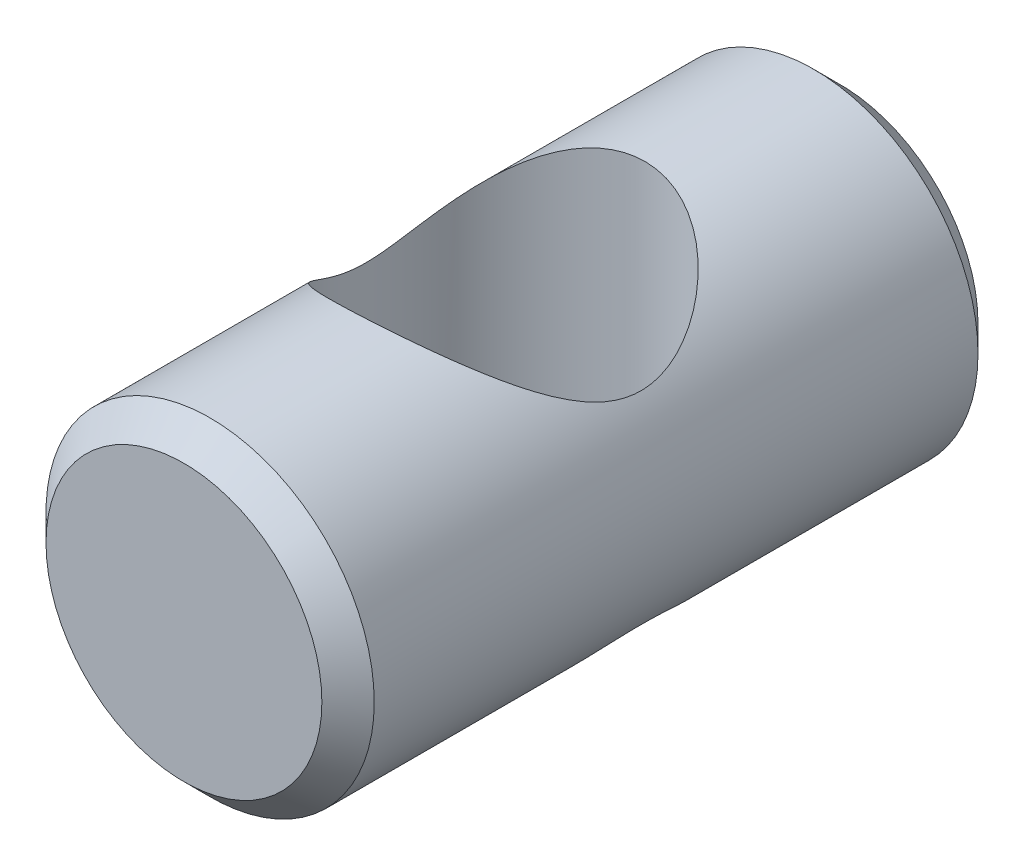
ISO-10303-21;
HEADER;
FILE_DESCRIPTION(('STEP AP214'),'2;1');
FILE_NAME('part.step','',(''),(''),'','','');
FILE_SCHEMA(('AUTOMOTIVE_DESIGN { 1 0 10303 214 1 1 1 1 }'));
ENDSEC;
DATA;
#1=APPLICATION_CONTEXT('core data for automotive mechanical design processes');
#2=APPLICATION_PROTOCOL_DEFINITION('international standard','automotive_design',2000,#1);
#3=PRODUCT_CONTEXT('',#1,'mechanical');
#4=PRODUCT('Part','Part','',(#3));
#5=PRODUCT_RELATED_PRODUCT_CATEGORY('part','',(#4));
#6=PRODUCT_DEFINITION_FORMATION('','',#4);
#7=PRODUCT_DEFINITION_CONTEXT('part definition',#1,'design');
#8=PRODUCT_DEFINITION('design','',#6,#7);
#9=PRODUCT_DEFINITION_SHAPE('','',#8);
#10=(LENGTH_UNIT() NAMED_UNIT(*) SI_UNIT(.MILLI.,.METRE.));
#11=(NAMED_UNIT(*) PLANE_ANGLE_UNIT() SI_UNIT($,.RADIAN.));
#12=(NAMED_UNIT(*) SI_UNIT($,.STERADIAN.) SOLID_ANGLE_UNIT());
#13=UNCERTAINTY_MEASURE_WITH_UNIT(LENGTH_MEASURE(1.E-05),#10,'distance_accuracy_value','');
#14=(GEOMETRIC_REPRESENTATION_CONTEXT(3) GLOBAL_UNCERTAINTY_ASSIGNED_CONTEXT((#13)) GLOBAL_UNIT_ASSIGNED_CONTEXT((#10,
#11,#12)) REPRESENTATION_CONTEXT('',''));
#15=CARTESIAN_POINT('',(0.,0.,0.));
#16=DIRECTION('',(0.,0.,1.));
#17=DIRECTION('',(1.,0.,0.));
#18=AXIS2_PLACEMENT_3D('',#15,#16,#17);
#19=CARTESIAN_POINT('',(0.,0.,9.525));
#20=DIRECTION('',(0.,0.,-1.));
#21=DIRECTION('',(-1.,0.,0.));
#22=AXIS2_PLACEMENT_3D('',#19,#20,#21);
#23=CYLINDRICAL_SURFACE('',#22,4.765);
#24=CARTESIAN_POINT('',(0.,-4.765,-3.99217985566783));
#25=CARTESIAN_POINT('',(-0.0932636342546237,-4.76499929685556,-3.99801953956757));
#26=CARTESIAN_POINT('',(-0.186746626324761,-4.76225587992272,-4.00058744573495));
#27=CARTESIAN_POINT('',(-0.373378545633254,-4.75126921844668,-3.99918661164055));
#28=CARTESIAN_POINT('',(-0.466527277697269,-4.74302316348069,-3.99521452961676));
#29=CARTESIAN_POINT('',(-0.651827972425573,-4.72112928459135,-3.98085197083435));
#30=CARTESIAN_POINT('',(-0.743978231756207,-4.7074733824887,-3.9704518824748));
#31=CARTESIAN_POINT('',(-0.92647593532388,-4.67498273941237,-3.94346225948741));
#32=CARTESIAN_POINT('',(-1.01682255283257,-4.65614567949148,-3.92686995219917));
#33=CARTESIAN_POINT('',(-1.19449183493765,-4.61375124749371,-3.88794952233966));
#34=CARTESIAN_POINT('',(-1.28183023187267,-4.59022506902588,-3.86565904281481));
#35=CARTESIAN_POINT('',(-1.45362173974024,-4.53875091504347,-3.81566600489297));
#36=CARTESIAN_POINT('',(-1.53807378716818,-4.51080133058981,-3.78796147636304));
#37=CARTESIAN_POINT('',(-1.78641383567682,-4.42096114353921,-3.69735690427841));
#38=CARTESIAN_POINT('',(-1.94543175511518,-4.35304329081578,-3.62693290874089));
#39=CARTESIAN_POINT('',(-2.30380451640421,-4.17741350012835,-3.44039707437933));
#40=CARTESIAN_POINT('',(-2.49667447952027,-4.06422801303888,-3.31699312897678));
#41=CARTESIAN_POINT('',(-2.76381181741647,-3.8830712430079,-3.11341573113442));
#42=CARTESIAN_POINT('',(-2.8492754907499,-3.82068612502346,-3.04235638115388));
#43=CARTESIAN_POINT('',(-3.01286512766343,-3.6930484581163,-2.89459974115908));
#44=CARTESIAN_POINT('',(-3.09099346555476,-3.62779684713207,-2.81790428987467));
#45=CARTESIAN_POINT('',(-3.24155101944227,-3.49398558877246,-2.6576258679043));
#46=CARTESIAN_POINT('',(-3.313824471458,-3.42538514803176,-2.5739314209996));
#47=CARTESIAN_POINT('',(-3.45087151066808,-3.28727366019987,-2.40136598261166));
#48=CARTESIAN_POINT('',(-3.5156468524533,-3.21776283039888,-2.31249620952354));
#49=CARTESIAN_POINT('',(-3.63770799140098,-3.0790946792254,-2.12967322939658));
#50=CARTESIAN_POINT('',(-3.695001351431,-3.00993706985463,-2.03572529342641));
#51=CARTESIAN_POINT('',(-3.80211687224711,-2.87343937308191,-1.84246198662627));
#52=CARTESIAN_POINT('',(-3.85194207105322,-2.8060985558074,-1.74314882084127));
#53=CARTESIAN_POINT('',(-3.95119517800654,-2.66492513869682,-1.52250650529235));
#54=CARTESIAN_POINT('',(-3.99932877587216,-2.59173667978181,-1.40017098870717));
#55=CARTESIAN_POINT('',(-4.08455770701651,-2.45521084972163,-1.14632971481291));
#56=CARTESIAN_POINT('',(-4.12165997592989,-2.39186730087765,-1.01482978384744));
#57=CARTESIAN_POINT('',(-4.17667849207109,-2.29413683913644,-0.77032943319409));
#58=CARTESIAN_POINT('',(-4.19698603169305,-2.25646351033573,-0.659227433665801));
#59=CARTESIAN_POINT('',(-4.2282884742733,-2.19725957629503,-0.431654967738876));
#60=CARTESIAN_POINT('',(-4.23931148038454,-2.17568027926007,-0.315201835356546));
#61=CARTESIAN_POINT('',(-4.25099603404465,-2.15278124463893,-0.0784809482425702));
#62=CARTESIAN_POINT('',(-4.25155342799019,-2.15166515917293,0.0418132279875593));
#63=CARTESIAN_POINT('',(-4.24195675176841,-2.17050845135498,0.280359395307959));
#64=CARTESIAN_POINT('',(-4.23178524644628,-2.19050213379165,0.398607743936912));
#65=CARTESIAN_POINT('',(-4.19825513172981,-2.25419755077492,0.657459710173462));
#66=CARTESIAN_POINT('',(-4.17229920322084,-2.30246865081475,0.796540923916213));
#67=CARTESIAN_POINT('',(-4.10807920158268,-2.4151826009121,1.06510156990961));
#68=CARTESIAN_POINT('',(-4.06976852369609,-2.47968647882197,1.19454232341063));
#69=CARTESIAN_POINT('',(-3.98601522639179,-2.61200165340933,1.43419443807786));
#70=CARTESIAN_POINT('',(-3.94142262237715,-2.67910014777304,1.54511107852799));
#71=CARTESIAN_POINT('',(-3.84371346339955,-2.81749481067995,1.76045879982678));
#72=CARTESIAN_POINT('',(-3.79059039517393,-2.88879416015316,1.86488483972058));
#73=CARTESIAN_POINT('',(-3.67598639221244,-3.03329424860508,2.06790143357886));
#74=CARTESIAN_POINT('',(-3.61449387085448,-3.10649750765333,2.16648362085392));
#75=CARTESIAN_POINT('',(-3.48325039204997,-3.25297781485761,2.35786944277051));
#76=CARTESIAN_POINT('',(-3.41350175312349,-3.32625483659505,2.45067468860063));
#77=CARTESIAN_POINT('',(-3.26080472031359,-3.47628728466866,2.63636742011279));
#78=CARTESIAN_POINT('',(-3.17729087693588,-3.55295601198909,2.72886182357702));
#79=CARTESIAN_POINT('',(-3.00063023192446,-3.70336473469613,2.90684681710094));
#80=CARTESIAN_POINT('',(-2.90748123235961,-3.77710405650594,2.9923358011076));
#81=CARTESIAN_POINT('',(-2.71173028204539,-3.91999683527538,3.15532014868628));
#82=CARTESIAN_POINT('',(-2.60915574803934,-3.9891626457682,3.23283738847382));
#83=CARTESIAN_POINT('',(-2.39444043296993,-4.12162802170452,3.3790928466628));
#84=CARTESIAN_POINT('',(-2.28230072868795,-4.18492824578615,3.44783205106556));
#85=CARTESIAN_POINT('',(-2.00708387624579,-4.32531195678045,3.59792880262123));
#86=CARTESIAN_POINT('',(-1.8400448188452,-4.39932361922773,3.67511755292219));
#87=CARTESIAN_POINT('',(-1.57834649321652,-4.49697235287117,3.77415259577446));
#88=CARTESIAN_POINT('',(-1.48923459808212,-4.5272994198286,3.80437811941918));
#89=CARTESIAN_POINT('',(-1.30770291626183,-4.58302662034325,3.85878559210083));
#90=CARTESIAN_POINT('',(-1.21528476319075,-4.60842914834178,3.88297047991306));
#91=CARTESIAN_POINT('',(-1.02692604453561,-4.6540430569794,3.92501915547262));
#92=CARTESIAN_POINT('',(-0.930962908485044,-4.67421043843836,3.9428298150059));
#93=CARTESIAN_POINT('',(-0.737002009159674,-4.70868852930462,3.97145208269209));
#94=CARTESIAN_POINT('',(-0.639005267288018,-4.72300210746424,3.98226712067922));
#95=CARTESIAN_POINT('',(-0.441801601954884,-4.74551184766624,3.99662148589615));
#96=CARTESIAN_POINT('',(-0.342594955976878,-4.75370938653063,4.00016245095548));
#97=CARTESIAN_POINT('',(-0.143881098687137,-4.76386599002772,3.99982611798257));
#98=CARTESIAN_POINT('',(-0.0443739186588217,-4.76582568299566,3.99594956717615));
#99=CARTESIAN_POINT('',(0.142601319844962,-4.76367488760205,3.98166000923224));
#100=CARTESIAN_POINT('',(0.230139663927012,-4.76023563527063,3.97204874882731));
#101=CARTESIAN_POINT('',(0.404095206882386,-4.74863633453285,3.94713752669736));
#102=CARTESIAN_POINT('',(0.490512044815661,-4.74047480305429,3.93183577836552));
#103=CARTESIAN_POINT('',(0.747125059008787,-4.70920634065063,3.87765618068095));
#104=CARTESIAN_POINT('',(0.914847520236653,-4.67931303119033,3.83049108297636));
#105=CARTESIAN_POINT('',(1.24212294869065,-4.60337990382,3.71540304092315));
#106=CARTESIAN_POINT('',(1.40150042512666,-4.55708733158365,3.64715743139954));
#107=CARTESIAN_POINT('',(1.70677269604494,-4.45177154387493,3.49289614723717));
#108=CARTESIAN_POINT('',(1.85266271807905,-4.39274384660379,3.40687421713155));
#109=CARTESIAN_POINT('',(2.18915745696832,-4.23794561030798,3.17924828832661));
#110=CARTESIAN_POINT('',(2.3721467545469,-4.13726698526423,3.02961945059424));
#111=CARTESIAN_POINT('',(2.623035922786,-3.97929534007322,2.78556581183073));
#112=CARTESIAN_POINT('',(2.7028792417831,-3.92535567931687,2.70074259403865));
#113=CARTESIAN_POINT('',(2.85459325731943,-3.81643994226184,2.52486999558882));
#114=CARTESIAN_POINT('',(2.92646724519662,-3.76146430488,2.43382321057071));
#115=CARTESIAN_POINT('',(3.06317911734919,-3.65102774584645,2.24426331421854));
#116=CARTESIAN_POINT('',(3.12789189999219,-3.59557234970936,2.1456569654534));
#117=CARTESIAN_POINT('',(3.24882151524593,-3.48668901429869,1.94222911514202));
#118=CARTESIAN_POINT('',(3.30503549413234,-3.43326176052369,1.83740554235624));
#119=CARTESIAN_POINT('',(3.40838410618299,-3.33067920198283,1.62186863871763));
#120=CARTESIAN_POINT('',(3.45554949313768,-3.28150975039353,1.51117695064001));
#121=CARTESIAN_POINT('',(3.54037501115689,-3.18980698862756,1.28366040396667));
#122=CARTESIAN_POINT('',(3.5780441070083,-3.14726743422372,1.1668414565304));
#123=CARTESIAN_POINT('',(3.64814965114855,-3.06587099413605,0.908322108013169));
#124=CARTESIAN_POINT('',(3.67882819124777,-3.02864871340586,0.765600256197071));
#125=CARTESIAN_POINT('',(3.72449410555849,-2.97232776750476,0.474358237270456));
#126=CARTESIAN_POINT('',(3.73951898417932,-2.95318579428961,0.325852817504354));
#127=CARTESIAN_POINT('',(3.75274148840374,-2.93637559438129,0.0259607635422211));
#128=CARTESIAN_POINT('',(3.75084476832033,-2.93882776397371,-0.125437322594934));
#129=CARTESIAN_POINT('',(3.73017661978895,-2.96500309963719,-0.425287492229992));
#130=CARTESIAN_POINT('',(3.71138031383829,-2.98875762429599,-0.573734902711168));
#131=CARTESIAN_POINT('',(3.65152271896217,-3.06175085297876,-0.901472958647738));
#132=CARTESIAN_POINT('',(3.60595080194968,-3.11600160720255,-1.0787760578486));
#133=CARTESIAN_POINT('',(3.49365442117246,-3.2413960807351,-1.42042411659735));
#134=CARTESIAN_POINT('',(3.42686384462841,-3.31259242257963,-1.58472654293495));
#135=CARTESIAN_POINT('',(3.29679559478011,-3.44124074215771,-1.85350304412674));
#136=CARTESIAN_POINT('',(3.2382614790395,-3.49657708741531,-1.96136167558924));
#137=CARTESIAN_POINT('',(3.11209270004812,-3.60932903386786,-2.17054437735947));
#138=CARTESIAN_POINT('',(3.04445439402694,-3.66674546058983,-2.27186580787049));
#139=CARTESIAN_POINT('',(2.90035007868133,-3.78175772998841,-2.46780668292897));
#140=CARTESIAN_POINT('',(2.82388912713526,-3.839353451633,-2.56242991765641));
#141=CARTESIAN_POINT('',(2.66221914118108,-3.95317605267761,-2.74478289160146));
#142=CARTESIAN_POINT('',(2.57700835864243,-4.0094026557543,-2.83251124708479));
#143=CARTESIAN_POINT('',(2.33677329418466,-4.15642496712074,-3.0579879320571));
#144=CARTESIAN_POINT('',(2.17374584376865,-4.24466619725767,-3.18908125437443));
#145=CARTESIAN_POINT('',(1.82419614507642,-4.40619271797231,-3.42669671450098));
#146=CARTESIAN_POINT('',(1.63770634909285,-4.47949830702031,-3.53325222674676));
#147=CARTESIAN_POINT('',(1.28011797844197,-4.5929147364465,-3.7000120526299));
#148=CARTESIAN_POINT('',(1.11250840852615,-4.63665241475381,-3.76513840525319));
#149=CARTESIAN_POINT('',(0.853418734453356,-4.68878292493938,-3.84586360663573));
#150=CARTESIAN_POINT('',(0.765839954281946,-4.70390790587259,-3.86993374570037));
#151=CARTESIAN_POINT('',(0.588598719639249,-4.72935218256618,-3.91216476438609));
#152=CARTESIAN_POINT('',(0.498937293708008,-4.73967379968741,-3.93032849716309));
#153=CARTESIAN_POINT('',(0.341089323310587,-4.75325936794163,-3.95667757036388));
#154=CARTESIAN_POINT('',(0.273221486548851,-4.75764920373837,-3.96622521479757));
#155=CARTESIAN_POINT('',(0.136942002996889,-4.7635201526144,-3.98183130377502));
#156=CARTESIAN_POINT('',(0.0685302207219283,-4.7650005166713,-3.98788884953458));
#157=CARTESIAN_POINT('',(0.,-4.765,-3.99217985566783));
#158=B_SPLINE_CURVE_WITH_KNOTS('',3,(#24,#25,#26,#27,#28,#29,#30,#31,#32,#33,#34,#35,#36,#37,
#38,#39,#40,#41,#42,#43,#44,#45,#46,#47,#48,#49,#50,#51,#52,#53,#54,#55,#56,#57,#58,#59,#60,#61,
#62,#63,#64,#65,#66,#67,#68,#69,#70,#71,#72,#73,#74,#75,#76,#77,#78,#79,#80,#81,#82,#83,#84,#85,
#86,#87,#88,#89,#90,#91,#92,#93,#94,#95,#96,#97,#98,#99,#100,#101,#102,#103,#104,#105,#106,#107,
#108,#109,#110,#111,#112,#113,#114,#115,#116,#117,#118,#119,#120,#121,#122,#123,#124,#125,#126,
#127,#128,#129,#130,#131,#132,#133,#134,#135,#136,#137,#138,#139,#140,#141,#142,#143,#144,#145,
#146,#147,#148,#149,#150,#151,#152,#153,#154,#155,#156,#157),.UNSPECIFIED.,.T.,.F.,(4,2,2,2,2,2,
2,2,2,2,2,2,2,2,2,2,2,2,2,2,2,2,2,2,2,2,2,2,2,2,2,2,2,2,2,2,2,2,2,2,2,2,2,2,2,2,2,2,2,2,2,2,2,2,
2,2,2,2,2,2,2,2,2,2,2,2,4),(0.,0.280265826861445,0.560674906639232,0.841504291286104,
1.12245957273513,1.40160473464658,1.68085166523384,2.23888909079667,3.00077725635895,
3.38287997126945,3.76485857716687,4.15492786307074,4.5449056857257,4.9344862120514,
5.32390782583272,5.77456067077657,6.22492957847529,6.58091540777701,6.93581979900076,
7.29425434128098,7.65327226155973,8.09924743224877,8.5469249908495,8.95763993355976,
9.36866997359288,9.78027494147721,10.1917645936129,10.6302174214189,11.0687704887338,
11.5060860161679,11.9433523784234,12.5356723506448,12.8319731662841,13.1281295492703,
13.4266998196923,13.7251235950143,14.0234801699009,14.3218066905205,14.5858743872524,
14.8500250617548,15.3778397270548,15.9141711264176,16.4506915825636,17.2170340148792,
17.6018633776267,17.9865332089459,18.3771144765845,18.7678266035234,19.1571863168469,
19.5461770746277,19.996418796461,20.4455792916556,20.897245621259,21.3495779293569,
21.9192403259633,22.4906953693511,22.8940908490988,23.2976482180078,23.7009753774066,
24.1043832749877,24.7827070696525,25.4601027384216,26.0127661488078,26.2887137242828,
26.5645278014728,26.7704144413039,26.9763540782173),.UNSPECIFIED.);
#159=CARTESIAN_POINT('',(0.,-4.765,-3.99217985566783));
#160=VERTEX_POINT('',#159);
#161=EDGE_CURVE('E10',#160,#160,#158,.T.);
#162=ORIENTED_EDGE('',*,*,#161,.T.);
#163=EDGE_LOOP('',(#162));
#164=FACE_BOUND('',#163,.T.);
#165=CARTESIAN_POINT('',(-0.25,4.75843724346555,4.));
#166=CARTESIAN_POINT('',(-0.34627465992084,4.75337975943751,4.00000064090504));
#167=CARTESIAN_POINT('',(-0.442387310668187,4.74539396220807,3.996518764775));
#168=CARTESIAN_POINT('',(-0.633502028508014,4.72368002268288,3.98272627911989));
#169=CARTESIAN_POINT('',(-0.72850365645028,4.70994968370328,3.9724130564415));
#170=CARTESIAN_POINT('',(-0.916702526039824,4.67696656303222,3.94519408254473));
#171=CARTESIAN_POINT('',(-1.00989742631419,4.6577070681138,3.9282803082389));
#172=CARTESIAN_POINT('',(-1.19371726954248,4.61402320678847,3.88822127388939));
#173=CARTESIAN_POINT('',(-1.28434098845932,4.58959642572554,3.86507309914442));
#174=CARTESIAN_POINT('',(-1.5501291100015,4.50957717649557,3.78728042140321));
#175=CARTESIAN_POINT('',(-1.72077564068079,4.44696165202984,3.72405073923505));
#176=CARTESIAN_POINT('',(-2.04661329479382,4.30676216337472,3.57828926640158));
#177=CARTESIAN_POINT('',(-2.20180353100751,4.22917734066973,3.49575636860523));
#178=CARTESIAN_POINT('',(-2.55671747619823,4.02807343448444,3.27699003598806));
#179=CARTESIAN_POINT('',(-2.74828306007134,3.89883442269683,3.1326696897264));
#180=CARTESIAN_POINT('',(-3.01055761233246,3.69515277123072,2.89710700638971));
#181=CARTESIAN_POINT('',(-3.09394580079139,3.62547157911947,2.81522169639595));
#182=CARTESIAN_POINT('',(-3.25246644763419,3.48395537277521,2.645498386816));
#183=CARTESIAN_POINT('',(-3.32760029938517,3.41212072466866,2.5576613959586));
#184=CARTESIAN_POINT('',(-3.47129287570058,3.26589972726585,2.37427049067649));
#185=CARTESIAN_POINT('',(-3.53966360660714,3.19149247163096,2.27858665519027));
#186=CARTESIAN_POINT('',(-3.66794394215212,3.04319223724461,2.08122996667882));
#187=CARTESIAN_POINT('',(-3.72784965149316,2.96929951003353,1.97955438676688));
#188=CARTESIAN_POINT('',(-3.83892379551144,2.82421753160467,1.77020735508714));
#189=CARTESIAN_POINT('',(-3.89011724847585,2.75302101188115,1.66255429093986));
#190=CARTESIAN_POINT('',(-3.98361705727386,2.61589024926147,1.44035440832748));
#191=CARTESIAN_POINT('',(-4.02593327931368,2.54995021537623,1.32581542709954));
#192=CARTESIAN_POINT('',(-4.09728703657317,2.4334463522119,1.10042903404067));
#193=CARTESIAN_POINT('',(-4.12722201203197,2.38200770830041,0.990329487631318));
#194=CARTESIAN_POINT('',(-4.17821787470173,2.29138166875942,0.763269207930586));
#195=CARTESIAN_POINT('',(-4.19929711705935,2.2521689765462,0.646323244456671));
#196=CARTESIAN_POINT('',(-4.2288253335911,2.19616421008226,0.423814054748796));
#197=CARTESIAN_POINT('',(-4.23866674992353,2.17693839901142,0.319073874900625));
#198=CARTESIAN_POINT('',(-4.24995388358446,2.15483025598569,0.107470933018347));
#199=CARTESIAN_POINT('',(-4.25141075426384,2.15192621249184,0.000611180578691213));
#200=CARTESIAN_POINT('',(-4.24579931100861,2.16296905073794,-0.211872048149847));
#201=CARTESIAN_POINT('',(-4.23873773472566,2.17690261481505,-0.317496434864719));
#202=CARTESIAN_POINT('',(-4.21677440735029,2.2191426956382,-0.525015715375955));
#203=CARTESIAN_POINT('',(-4.2018577564571,2.24747652377266,-0.626903126518766));
#204=CARTESIAN_POINT('',(-4.15293665954614,2.33715799531474,-0.891904410345845));
#205=CARTESIAN_POINT('',(-4.11283562656993,2.40792816186499,-1.05064914098815));
#206=CARTESIAN_POINT('',(-4.04090286375969,2.52557172047843,-1.27885009306609));
#207=CARTESIAN_POINT('',(-4.01488107845955,2.56681966037105,-1.35343992925239));
#208=CARTESIAN_POINT('',(-3.95908693709358,2.65206279668428,-1.49959391386634));
#209=CARTESIAN_POINT('',(-3.9293156893634,2.69605717933017,-1.57115894810576));
#210=CARTESIAN_POINT('',(-3.84365607932113,2.8178642431166,-1.76154511585717));
#211=CARTESIAN_POINT('',(-3.78428071051058,2.8974244921385,-1.87767935329263));
#212=CARTESIAN_POINT('',(-3.65524648091415,3.05860902074752,-2.10264253641082));
#213=CARTESIAN_POINT('',(-3.58558102511783,3.14023459601011,-2.21146673146299));
#214=CARTESIAN_POINT('',(-3.43604155076692,3.303189680786,-2.4219379562844));
#215=CARTESIAN_POINT('',(-3.35617579082569,3.38451937566622,-2.52359069014903));
#216=CARTESIAN_POINT('',(-3.18613367578069,3.54506119118226,-2.71954733160134));
#217=CARTESIAN_POINT('',(-3.0959620354966,3.62427425984779,-2.81385456672749));
#218=CARTESIAN_POINT('',(-2.85001595862574,3.82362742932879,-3.04678340463435));
#219=CARTESIAN_POINT('',(-2.68637932163794,3.94104969375965,-3.17962738650602));
#220=CARTESIAN_POINT('',(-2.33309771565886,4.15992250133354,-3.42145795709655));
#221=CARTESIAN_POINT('',(-2.14350114874585,4.26140203065883,-3.53048798728598));
#222=CARTESIAN_POINT('',(-1.78034877835455,4.42342953481607,-3.6999535158214));
#223=CARTESIAN_POINT('',(-1.61119154806348,4.48810475431538,-3.76574860614816));
#224=CARTESIAN_POINT('',(-1.3479332990087,4.57130299241881,-3.84746899939421));
#225=CARTESIAN_POINT('',(-1.2585665650257,4.59673860242333,-3.87188497572809));
#226=CARTESIAN_POINT('',(-1.0771517707338,4.64259686443313,-3.91465072398747));
#227=CARTESIAN_POINT('',(-0.985104880593632,4.66302166852781,-3.93300310134463));
#228=CARTESIAN_POINT('',(-0.79831975616411,4.69861798385104,-3.9633771838394));
#229=CARTESIAN_POINT('',(-0.703567733560013,4.71375380248022,-3.97535615101544));
#230=CARTESIAN_POINT('',(-0.512754515747438,4.73830735834007,-3.99250946263296));
#231=CARTESIAN_POINT('',(-0.416693925196343,4.74772765067709,-3.99768684890576));
#232=CARTESIAN_POINT('',(-0.224053403473667,4.76070770231354,-4.00107494244159));
#233=CARTESIAN_POINT('',(-0.127473506398432,4.76426784177351,-3.99928610164387));
#234=CARTESIAN_POINT('',(0.0653108697711223,4.76552941755137,-3.98872356539716));
#235=CARTESIAN_POINT('',(0.161515374963457,4.76323126868879,-3.97995036453395));
#236=CARTESIAN_POINT('',(0.429496277499973,4.74873006465728,-3.94567816183399));
#237=CARTESIAN_POINT('',(0.600024517199027,4.73006321574309,-3.91240877824167));
#238=CARTESIAN_POINT('',(0.932710717739463,4.67587229075447,-3.82503185241182));
#239=CARTESIAN_POINT('',(1.09486645735113,4.64034376648761,-3.77091881222579));
#240=CARTESIAN_POINT('',(1.41557999993905,4.55305730944743,-3.64105007302511));
#241=CARTESIAN_POINT('',(1.57355484343883,4.50057821809412,-3.5643494323036));
#242=CARTESIAN_POINT('',(1.87476627330075,4.38367647692629,-3.39343472442461));
#243=CARTESIAN_POINT('',(2.01800140209067,4.31925264768906,-3.29921892781923));
#244=CARTESIAN_POINT('',(2.31387040958301,4.16936165633887,-3.07683030737472));
#245=CARTESIAN_POINT('',(2.46333910083244,4.08220649438385,-2.94560000518553));
#246=CARTESIAN_POINT('',(2.74002211077138,3.90189847378619,-2.66436179502179));
#247=CARTESIAN_POINT('',(2.86717908671495,3.80873097893388,-2.51430715479735));
#248=CARTESIAN_POINT('',(3.05309114897676,3.65951069049002,-2.25916693622253));
#249=CARTESIAN_POINT('',(3.11914273314451,3.60319966763547,-2.15945936408954));
#250=CARTESIAN_POINT('',(3.24253068670825,3.49257451867627,-1.95362194906918));
#251=CARTESIAN_POINT('',(3.2998630611348,3.43826131652214,-1.84748919323888));
#252=CARTESIAN_POINT('',(3.40523470339531,3.33392917171794,-1.62908474234014));
#253=CARTESIAN_POINT('',(3.45329907177569,3.28389884035372,-1.51683071557005));
#254=CARTESIAN_POINT('',(3.53963900203655,3.19064493545243,-1.28600339284153));
#255=CARTESIAN_POINT('',(3.57792452615421,3.14741445193658,-1.16743667801894));
#256=CARTESIAN_POINT('',(3.64843826212001,3.06552644276119,-0.907080571739073));
#257=CARTESIAN_POINT('',(3.67906832377435,3.02835618048747,-0.764363752763215));
#258=CARTESIAN_POINT('',(3.72463435396844,2.97215099792122,-0.473167828768642));
#259=CARTESIAN_POINT('',(3.73961064273783,2.95306949734237,-0.324704554381361));
#260=CARTESIAN_POINT('',(3.75274658802815,2.93636880082835,-0.0249040341882249));
#261=CARTESIAN_POINT('',(3.75081114698758,2.93887097258069,0.126444682372085));
#262=CARTESIAN_POINT('',(3.73007788691388,2.96512759906693,0.426194852840394));
#263=CARTESIAN_POINT('',(3.71125444038629,2.9889143529413,0.574591477000311));
#264=CARTESIAN_POINT('',(3.6513276928063,3.06198467788289,0.902328475331606));
#265=CARTESIAN_POINT('',(3.60570186711034,3.11629177759942,1.07967436360577));
#266=CARTESIAN_POINT('',(3.49328843609878,3.24179255366017,1.42139489293831));
#267=CARTESIAN_POINT('',(3.42643494986667,3.3130386255014,1.58572713480459));
#268=CARTESIAN_POINT('',(3.29626436856903,3.44175042653383,1.85451962881735));
#269=CARTESIAN_POINT('',(3.23769562754517,3.49710188014904,1.96236825153308));
#270=CARTESIAN_POINT('',(3.11145674099639,3.60987808361638,2.17152964776801));
#271=CARTESIAN_POINT('',(3.04378295742635,3.66730365546673,2.2728397846787));
#272=CARTESIAN_POINT('',(2.89960444723238,3.78233030580161,2.46875897146219));
#273=CARTESIAN_POINT('',(2.82310453805714,3.83993127199291,2.56337163185138));
#274=CARTESIAN_POINT('',(2.66135476745776,3.95375887667293,2.74570049267473));
#275=CARTESIAN_POINT('',(2.57610315785917,4.0099852377927,2.83341530904307));
#276=CARTESIAN_POINT('',(2.33580272507686,4.15697054280164,3.05880653465497));
#277=CARTESIAN_POINT('',(2.1727565401097,4.24517224445871,3.18983082562772));
#278=CARTESIAN_POINT('',(1.82320816087493,4.40660018917108,3.4272910340576));
#279=CARTESIAN_POINT('',(1.63674181722378,4.47984888108339,3.53376384210405));
#280=CARTESIAN_POINT('',(1.27812738863083,4.59350930157674,3.70088943237953));
#281=CARTESIAN_POINT('',(1.1093719710405,4.63744948462555,3.76632970538242));
#282=CARTESIAN_POINT('',(0.84843176686246,4.68969995832505,3.84730609016714));
#283=CARTESIAN_POINT('',(0.760186940576753,4.70483686161144,3.87142807035924));
#284=CARTESIAN_POINT('',(0.581595100740546,4.73023181656353,3.91367558468328));
#285=CARTESIAN_POINT('',(0.491248768100426,4.74049142604896,3.93180303291974));
#286=CARTESIAN_POINT('',(0.293054815163994,4.75719382369709,3.96445094645018));
#287=CARTESIAN_POINT('',(0.184923263713776,4.76264823099485,3.97777665522621));
#288=CARTESIAN_POINT('',(-0.0322077266319243,4.76612807893754,3.99555153489534));
#289=CARTESIAN_POINT('',(-0.14120730250681,4.76415232291003,3.99999927576178));
#290=CARTESIAN_POINT('',(-0.25,4.75843724346555,4.));
#291=B_SPLINE_CURVE_WITH_KNOTS('',3,(#165,#166,#167,#168,#169,#170,#171,#172,#173,#174,#175,
#176,#177,#178,#179,#180,#181,#182,#183,#184,#185,#186,#187,#188,#189,#190,#191,#192,#193,#194,
#195,#196,#197,#198,#199,#200,#201,#202,#203,#204,#205,#206,#207,#208,#209,#210,#211,#212,#213,
#214,#215,#216,#217,#218,#219,#220,#221,#222,#223,#224,#225,#226,#227,#228,#229,#230,#231,#232,
#233,#234,#235,#236,#237,#238,#239,#240,#241,#242,#243,#244,#245,#246,#247,#248,#249,#250,#251,
#252,#253,#254,#255,#256,#257,#258,#259,#260,#261,#262,#263,#264,#265,#266,#267,#268,#269,#270,
#271,#272,#273,#274,#275,#276,#277,#278,#279,#280,#281,#282,#283,#284,#285,#286,#287,#288,#289,
#290),.UNSPECIFIED.,.T.,.F.,(4,2,2,2,2,2,2,2,2,2,2,2,2,2,2,2,2,2,2,2,2,2,2,2,2,2,2,2,2,2,2,2,2,
2,2,2,2,2,2,2,2,2,2,2,2,2,2,2,2,2,2,2,2,2,2,2,2,2,2,2,2,2,4),(0.,0.289102734592412,
0.578316121803985,0.867882153503534,1.15758379856276,1.73222501978116,2.30689920748663,
3.1194611094955,3.52738643142066,3.93524278766983,4.35235840410654,4.76966534135464,
5.18575293506752,5.60137560753134,5.97605506066589,6.34995404342222,6.66939365927852,
6.98840824946942,7.30717068095035,7.62653994258005,8.15840827179156,8.42569452986046,
8.69290196312974,9.15062366343806,9.6086400049812,10.0662878397265,10.5237271377364,
11.2447497117665,11.9644458009958,12.5399278355537,12.8278335507255,13.1156153960359,
13.405303435385,13.6948618750893,13.984401529784,14.2739206830354,14.7955521468059,
15.3173212960632,15.8651175723339,16.4129679668095,17.0621924694478,17.7130618362497,
18.1092578733456,18.5056348962489,18.9009228501391,19.2958064820137,19.7459674719579,
20.194966080064,20.6464911022427,21.0987024733013,21.6685694586431,22.2402226264302,
22.6436579483775,23.0472549498569,23.4506326942304,23.8540911717034,24.5322889207172,
25.2094608840597,25.7656638760586,26.0435457798117,26.3213388676636,26.6479793501879,
26.9746724423767),.UNSPECIFIED.);
#292=CARTESIAN_POINT('',(-0.25,4.75843724346555,4.));
#293=VERTEX_POINT('',#292);
#294=EDGE_CURVE('E54',#293,#293,#291,.T.);
#295=ORIENTED_EDGE('',*,*,#294,.T.);
#296=EDGE_LOOP('',(#295));
#297=FACE_BOUND('',#296,.T.);
#298=CARTESIAN_POINT('',(0.,0.,-8.76499999999999));
#299=DIRECTION('',(0.,0.,1.));
#300=DIRECTION('',(1.,0.,0.));
#301=AXIS2_PLACEMENT_3D('',#298,#299,#300);
#302=CIRCLE('',#301,4.765);
#303=CARTESIAN_POINT('',(4.765,0.,-8.76499999999999));
#304=VERTEX_POINT('',#303);
#305=EDGE_CURVE('E95',#304,#304,#302,.T.);
#306=ORIENTED_EDGE('',*,*,#305,.T.);
#307=EDGE_LOOP('',(#306));
#308=FACE_BOUND('',#307,.T.);
#309=CARTESIAN_POINT('',(0.,0.,8.76500000000001));
#310=DIRECTION('',(0.,0.,1.));
#311=DIRECTION('',(1.,0.,0.));
#312=AXIS2_PLACEMENT_3D('',#309,#310,#311);
#313=CIRCLE('',#312,4.765);
#314=CARTESIAN_POINT('',(4.765,0.,8.76500000000001));
#315=VERTEX_POINT('',#314);
#316=EDGE_CURVE('E98',#315,#315,#313,.F.);
#317=ORIENTED_EDGE('',*,*,#316,.T.);
#318=EDGE_LOOP('',(#317));
#319=FACE_BOUND('',#318,.T.);
#320=ADVANCED_FACE('F41',(#164,#297,#308,#319),#23,.T.);
#321=CARTESIAN_POINT('',(0.,0.,9.525));
#322=DIRECTION('',(0.,0.,1.));
#323=DIRECTION('',(1.,0.,0.));
#324=AXIS2_PLACEMENT_3D('',#321,#322,#323);
#325=PLANE('',#324);
#326=CARTESIAN_POINT('',(0.,0.,9.525));
#327=DIRECTION('',(0.,0.,1.));
#328=DIRECTION('',(1.,0.,0.));
#329=AXIS2_PLACEMENT_3D('',#326,#327,#328);
#330=CIRCLE('',#329,4.00500000000001);
#331=CARTESIAN_POINT('',(4.00500000000001,0.,9.525));
#332=VERTEX_POINT('',#331);
#333=EDGE_CURVE('E58',#332,#332,#330,.T.);
#334=ORIENTED_EDGE('',*,*,#333,.T.);
#335=EDGE_LOOP('',(#334));
#336=FACE_BOUND('',#335,.T.);
#337=ADVANCED_FACE('F75',(#336),#325,.T.);
#338=CARTESIAN_POINT('',(0.,0.,-9.525));
#339=DIRECTION('',(0.,0.,1.));
#340=DIRECTION('',(1.,0.,0.));
#341=AXIS2_PLACEMENT_3D('',#338,#339,#340);
#342=PLANE('',#341);
#343=CARTESIAN_POINT('',(0.,0.,-9.525));
#344=DIRECTION('',(0.,0.,1.));
#345=DIRECTION('',(1.,0.,0.));
#346=AXIS2_PLACEMENT_3D('',#343,#344,#345);
#347=CIRCLE('',#346,4.00499999999998);
#348=CARTESIAN_POINT('',(4.00499999999998,0.,-9.525));
#349=VERTEX_POINT('',#348);
#350=EDGE_CURVE('E62',#349,#349,#347,.F.);
#351=ORIENTED_EDGE('',*,*,#350,.T.);
#352=EDGE_LOOP('',(#351));
#353=FACE_BOUND('',#352,.T.);
#354=ADVANCED_FACE('F78',(#353),#342,.F.);
#355=CARTESIAN_POINT('',(0.,0.,-8.76499999999999));
#356=DIRECTION('',(0.,0.,1.));
#357=DIRECTION('',(1.,0.,0.));
#358=AXIS2_PLACEMENT_3D('',#355,#356,#357);
#359=CONICAL_SURFACE('',#358,4.765,0.78539816339745);
#360=ORIENTED_EDGE('',*,*,#350,.F.);
#361=EDGE_LOOP('',(#360));
#362=FACE_BOUND('',#361,.T.);
#363=ORIENTED_EDGE('',*,*,#305,.F.);
#364=EDGE_LOOP('',(#363));
#365=FACE_BOUND('',#364,.T.);
#366=ADVANCED_FACE('F81',(#362,#365),#359,.T.);
#367=CARTESIAN_POINT('',(0.,0.,9.525));
#368=DIRECTION('',(0.,0.,-1.));
#369=DIRECTION('',(-1.,0.,0.));
#370=AXIS2_PLACEMENT_3D('',#367,#368,#369);
#371=CONICAL_SURFACE('',#370,4.00500000000001,0.785398163397449);
#372=ORIENTED_EDGE('',*,*,#316,.F.);
#373=EDGE_LOOP('',(#372));
#374=FACE_BOUND('',#373,.T.);
#375=ORIENTED_EDGE('',*,*,#333,.F.);
#376=EDGE_LOOP('',(#375));
#377=FACE_BOUND('',#376,.T.);
#378=ADVANCED_FACE('F44',(#374,#377),#371,.T.);
#379=CARTESIAN_POINT('',(-0.25,-4.765,0.));
#380=DIRECTION('',(0.,1.,0.));
#381=DIRECTION('',(0.,0.,1.));
#382=AXIS2_PLACEMENT_3D('',#379,#380,#381);
#383=CYLINDRICAL_SURFACE('',#382,4.);
#384=ORIENTED_EDGE('',*,*,#294,.F.);
#385=EDGE_LOOP('',(#384));
#386=FACE_BOUND('',#385,.T.);
#387=ORIENTED_EDGE('',*,*,#161,.F.);
#388=EDGE_LOOP('',(#387));
#389=FACE_BOUND('',#388,.T.);
#390=ADVANCED_FACE('F70',(#386,#389),#383,.F.);
#391=CLOSED_SHELL('',(#320,#337,#354,#366,#378,#390));
#392=MANIFOLD_SOLID_BREP('B2',#391);
#393=ADVANCED_BREP_SHAPE_REPRESENTATION('',(#18,#392),#14);
#394=SHAPE_DEFINITION_REPRESENTATION(#9,#393);
ENDSEC;
END-ISO-10303-21;
